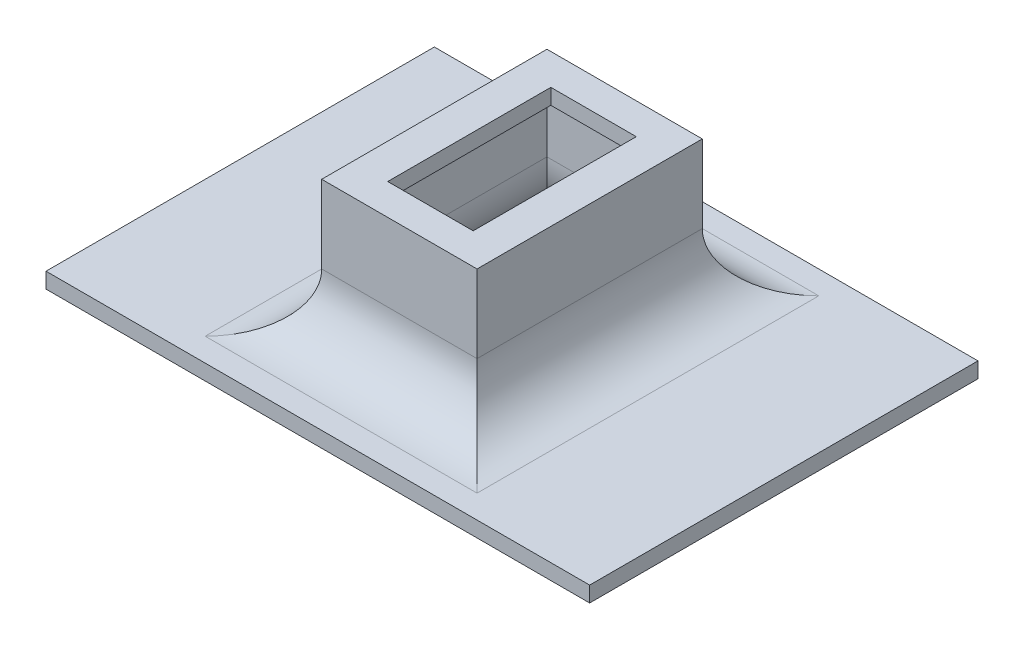
ISO-10303-21;
HEADER;
FILE_DESCRIPTION(('STEP AP214'),'2;1');
FILE_NAME('part.step','',(''),(''),'','','');
FILE_SCHEMA(('AUTOMOTIVE_DESIGN { 1 0 10303 214 1 1 1 1 }'));
ENDSEC;
DATA;
#1=APPLICATION_CONTEXT('core data for automotive mechanical design processes');
#2=APPLICATION_PROTOCOL_DEFINITION('international standard','automotive_design',2000,#1);
#3=PRODUCT_CONTEXT('',#1,'mechanical');
#4=PRODUCT('Part','Part','',(#3));
#5=PRODUCT_RELATED_PRODUCT_CATEGORY('part','',(#4));
#6=PRODUCT_DEFINITION_FORMATION('','',#4);
#7=PRODUCT_DEFINITION_CONTEXT('part definition',#1,'design');
#8=PRODUCT_DEFINITION('design','',#6,#7);
#9=PRODUCT_DEFINITION_SHAPE('','',#8);
#10=(LENGTH_UNIT() NAMED_UNIT(*) SI_UNIT(.MILLI.,.METRE.));
#11=(NAMED_UNIT(*) PLANE_ANGLE_UNIT() SI_UNIT($,.RADIAN.));
#12=(NAMED_UNIT(*) SI_UNIT($,.STERADIAN.) SOLID_ANGLE_UNIT());
#13=UNCERTAINTY_MEASURE_WITH_UNIT(LENGTH_MEASURE(1.E-05),#10,'distance_accuracy_value','');
#14=(GEOMETRIC_REPRESENTATION_CONTEXT(3) GLOBAL_UNCERTAINTY_ASSIGNED_CONTEXT((#13)) GLOBAL_UNIT_ASSIGNED_CONTEXT((#10,
#11,#12)) REPRESENTATION_CONTEXT('',''));
#15=CARTESIAN_POINT('',(0.,0.,0.));
#16=DIRECTION('',(0.,0.,1.));
#17=DIRECTION('',(1.,0.,0.));
#18=AXIS2_PLACEMENT_3D('',#15,#16,#17);
#19=CARTESIAN_POINT('',(0.,-4.,0.));
#20=DIRECTION('',(0.,1.,0.));
#21=DIRECTION('',(0.,0.,1.));
#22=AXIS2_PLACEMENT_3D('',#19,#20,#21);
#23=PLANE('',#22);
#24=DIRECTION('',(0.,0.,1.));
#25=VECTOR('',#24,1.);
#26=CARTESIAN_POINT('',(-70.,-4.,-50.));
#27=LINE('',#26,#25);
#28=CARTESIAN_POINT('',(-70.,-4.,-50.));
#29=VERTEX_POINT('',#28);
#30=CARTESIAN_POINT('',(-70.,-4.,50.));
#31=VERTEX_POINT('',#30);
#32=EDGE_CURVE('E273',#29,#31,#27,.T.);
#33=ORIENTED_EDGE('',*,*,#32,.F.);
#34=DIRECTION('',(-1.,0.,0.));
#35=VECTOR('',#34,1.);
#36=CARTESIAN_POINT('',(-70.,-4.,-50.));
#37=LINE('',#36,#35);
#38=CARTESIAN_POINT('',(70.,-4.,-50.));
#39=VERTEX_POINT('',#38);
#40=EDGE_CURVE('E283',#39,#29,#37,.T.);
#41=ORIENTED_EDGE('',*,*,#40,.F.);
#42=DIRECTION('',(0.,0.,-1.));
#43=VECTOR('',#42,1.);
#44=CARTESIAN_POINT('',(70.,-4.,-50.));
#45=LINE('',#44,#43);
#46=CARTESIAN_POINT('',(70.,-4.,50.));
#47=VERTEX_POINT('',#46);
#48=EDGE_CURVE('E280',#47,#39,#45,.T.);
#49=ORIENTED_EDGE('',*,*,#48,.F.);
#50=DIRECTION('',(1.,0.,0.));
#51=VECTOR('',#50,1.);
#52=CARTESIAN_POINT('',(-70.,-4.,50.));
#53=LINE('',#52,#51);
#54=EDGE_CURVE('E276',#31,#47,#53,.T.);
#55=ORIENTED_EDGE('',*,*,#54,.F.);
#56=EDGE_LOOP('',(#33,#41,#49,#55));
#57=FACE_BOUND('',#56,.T.);
#58=DIRECTION('',(1.,0.,0.));
#59=VECTOR('',#58,1.);
#60=CARTESIAN_POINT('',(0.,-4.,-44.));
#61=LINE('',#60,#59);
#62=CARTESIAN_POINT('',(-35.,-4.,-44.));
#63=VERTEX_POINT('',#62);
#64=CARTESIAN_POINT('',(35.,-4.,-44.));
#65=VERTEX_POINT('',#64);
#66=EDGE_CURVE('E208',#63,#65,#61,.T.);
#67=ORIENTED_EDGE('',*,*,#66,.F.);
#68=DIRECTION('',(0.,0.,1.));
#69=VECTOR('',#68,1.);
#70=CARTESIAN_POINT('',(-35.,-4.,0.));
#71=LINE('',#70,#69);
#72=CARTESIAN_POINT('',(-35.,-4.,44.));
#73=VERTEX_POINT('',#72);
#74=EDGE_CURVE('E205',#73,#63,#71,.F.);
#75=ORIENTED_EDGE('',*,*,#74,.F.);
#76=DIRECTION('',(1.,0.,0.));
#77=VECTOR('',#76,1.);
#78=CARTESIAN_POINT('',(0.,-4.,44.));
#79=LINE('',#78,#77);
#80=CARTESIAN_POINT('',(35.,-4.,44.));
#81=VERTEX_POINT('',#80);
#82=EDGE_CURVE('E200',#81,#73,#79,.F.);
#83=ORIENTED_EDGE('',*,*,#82,.F.);
#84=DIRECTION('',(0.,0.,1.));
#85=VECTOR('',#84,1.);
#86=CARTESIAN_POINT('',(35.,-4.,0.));
#87=LINE('',#86,#85);
#88=EDGE_CURVE('E203',#65,#81,#87,.T.);
#89=ORIENTED_EDGE('',*,*,#88,.F.);
#90=EDGE_LOOP('',(#67,#75,#83,#89));
#91=FACE_BOUND('',#90,.T.);
#92=ADVANCED_FACE('F34',(#57,#91),#23,.F.);
#93=CARTESIAN_POINT('',(0.,0.,0.));
#94=DIRECTION('',(0.,1.,0.));
#95=DIRECTION('',(0.,0.,1.));
#96=AXIS2_PLACEMENT_3D('',#93,#94,#95);
#97=PLANE('',#96);
#98=DIRECTION('',(1.,0.,0.));
#99=VECTOR('',#98,1.);
#100=CARTESIAN_POINT('',(0.,0.,44.));
#101=LINE('',#100,#99);
#102=CARTESIAN_POINT('',(35.,0.,44.));
#103=VERTEX_POINT('',#102);
#104=CARTESIAN_POINT('',(-35.,0.,44.));
#105=VERTEX_POINT('',#104);
#106=EDGE_CURVE('E307',#103,#105,#101,.F.);
#107=ORIENTED_EDGE('',*,*,#106,.T.);
#108=DIRECTION('',(0.,0.,1.));
#109=VECTOR('',#108,1.);
#110=CARTESIAN_POINT('',(-35.,0.,0.));
#111=LINE('',#110,#109);
#112=CARTESIAN_POINT('',(-35.,0.,-44.));
#113=VERTEX_POINT('',#112);
#114=EDGE_CURVE('E313',#105,#113,#111,.F.);
#115=ORIENTED_EDGE('',*,*,#114,.T.);
#116=DIRECTION('',(-1.,0.,0.));
#117=VECTOR('',#116,1.);
#118=CARTESIAN_POINT('',(0.,0.,-44.));
#119=LINE('',#118,#117);
#120=CARTESIAN_POINT('',(35.,0.,-44.));
#121=VERTEX_POINT('',#120);
#122=EDGE_CURVE('E311',#113,#121,#119,.F.);
#123=ORIENTED_EDGE('',*,*,#122,.T.);
#124=DIRECTION('',(0.,0.,-1.));
#125=VECTOR('',#124,1.);
#126=CARTESIAN_POINT('',(35.,0.,0.));
#127=LINE('',#126,#125);
#128=EDGE_CURVE('E309',#121,#103,#127,.F.);
#129=ORIENTED_EDGE('',*,*,#128,.T.);
#130=EDGE_LOOP('',(#107,#115,#123,#129));
#131=FACE_BOUND('',#130,.T.);
#132=DIRECTION('',(0.,0.,1.));
#133=VECTOR('',#132,1.);
#134=CARTESIAN_POINT('',(-70.,0.,-50.));
#135=LINE('',#134,#133);
#136=CARTESIAN_POINT('',(-70.,0.,-50.));
#137=VERTEX_POINT('',#136);
#138=CARTESIAN_POINT('',(-70.,0.,50.));
#139=VERTEX_POINT('',#138);
#140=EDGE_CURVE('E272',#137,#139,#135,.T.);
#141=ORIENTED_EDGE('',*,*,#140,.T.);
#142=DIRECTION('',(1.,0.,0.));
#143=VECTOR('',#142,1.);
#144=CARTESIAN_POINT('',(-70.,0.,50.));
#145=LINE('',#144,#143);
#146=CARTESIAN_POINT('',(70.,0.,50.));
#147=VERTEX_POINT('',#146);
#148=EDGE_CURVE('E289',#139,#147,#145,.T.);
#149=ORIENTED_EDGE('',*,*,#148,.T.);
#150=DIRECTION('',(0.,0.,-1.));
#151=VECTOR('',#150,1.);
#152=CARTESIAN_POINT('',(70.,0.,-50.));
#153=LINE('',#152,#151);
#154=CARTESIAN_POINT('',(70.,0.,-50.));
#155=VERTEX_POINT('',#154);
#156=EDGE_CURVE('E292',#147,#155,#153,.T.);
#157=ORIENTED_EDGE('',*,*,#156,.T.);
#158=DIRECTION('',(-1.,0.,0.));
#159=VECTOR('',#158,1.);
#160=CARTESIAN_POINT('',(-70.,0.,-50.));
#161=LINE('',#160,#159);
#162=EDGE_CURVE('E277',#155,#137,#161,.T.);
#163=ORIENTED_EDGE('',*,*,#162,.T.);
#164=EDGE_LOOP('',(#141,#149,#157,#163));
#165=FACE_BOUND('',#164,.T.);
#166=ADVANCED_FACE('F354',(#131,#165),#97,.T.);
#167=CARTESIAN_POINT('',(-70.,-4.,-50.));
#168=DIRECTION('',(-1.,0.,0.));
#169=DIRECTION('',(0.,0.,1.));
#170=AXIS2_PLACEMENT_3D('',#167,#168,#169);
#171=PLANE('',#170);
#172=ORIENTED_EDGE('',*,*,#140,.F.);
#173=DIRECTION('',(0.,1.,0.));
#174=VECTOR('',#173,1.);
#175=CARTESIAN_POINT('',(-70.,-4.,-50.));
#176=LINE('',#175,#174);
#177=EDGE_CURVE('E297',#29,#137,#176,.T.);
#178=ORIENTED_EDGE('',*,*,#177,.F.);
#179=ORIENTED_EDGE('',*,*,#32,.T.);
#180=DIRECTION('',(0.,1.,0.));
#181=VECTOR('',#180,1.);
#182=CARTESIAN_POINT('',(-70.,-4.,50.));
#183=LINE('',#182,#181);
#184=EDGE_CURVE('E286',#31,#139,#183,.T.);
#185=ORIENTED_EDGE('',*,*,#184,.T.);
#186=EDGE_LOOP('',(#172,#178,#179,#185));
#187=FACE_BOUND('',#186,.T.);
#188=ADVANCED_FACE('F360',(#187),#171,.T.);
#189=CARTESIAN_POINT('',(-70.,-4.,-50.));
#190=DIRECTION('',(0.,0.,-1.));
#191=DIRECTION('',(-1.,0.,0.));
#192=AXIS2_PLACEMENT_3D('',#189,#190,#191);
#193=PLANE('',#192);
#194=ORIENTED_EDGE('',*,*,#162,.F.);
#195=DIRECTION('',(0.,1.,0.));
#196=VECTOR('',#195,1.);
#197=CARTESIAN_POINT('',(70.,-4.,-50.));
#198=LINE('',#197,#196);
#199=EDGE_CURVE('E300',#39,#155,#198,.T.);
#200=ORIENTED_EDGE('',*,*,#199,.F.);
#201=ORIENTED_EDGE('',*,*,#40,.T.);
#202=ORIENTED_EDGE('',*,*,#177,.T.);
#203=EDGE_LOOP('',(#194,#200,#201,#202));
#204=FACE_BOUND('',#203,.T.);
#205=ADVANCED_FACE('F369',(#204),#193,.T.);
#206=CARTESIAN_POINT('',(70.,-4.,-50.));
#207=DIRECTION('',(1.,0.,0.));
#208=DIRECTION('',(0.,0.,-1.));
#209=AXIS2_PLACEMENT_3D('',#206,#207,#208);
#210=PLANE('',#209);
#211=ORIENTED_EDGE('',*,*,#156,.F.);
#212=DIRECTION('',(0.,1.,0.));
#213=VECTOR('',#212,1.);
#214=CARTESIAN_POINT('',(70.,-4.,50.));
#215=LINE('',#214,#213);
#216=EDGE_CURVE('E302',#47,#147,#215,.T.);
#217=ORIENTED_EDGE('',*,*,#216,.F.);
#218=ORIENTED_EDGE('',*,*,#48,.T.);
#219=ORIENTED_EDGE('',*,*,#199,.T.);
#220=EDGE_LOOP('',(#211,#217,#218,#219));
#221=FACE_BOUND('',#220,.T.);
#222=ADVANCED_FACE('F372',(#221),#210,.T.);
#223=CARTESIAN_POINT('',(-70.,-4.,50.));
#224=DIRECTION('',(0.,0.,1.));
#225=DIRECTION('',(1.,0.,0.));
#226=AXIS2_PLACEMENT_3D('',#223,#224,#225);
#227=PLANE('',#226);
#228=ORIENTED_EDGE('',*,*,#148,.F.);
#229=ORIENTED_EDGE('',*,*,#184,.F.);
#230=ORIENTED_EDGE('',*,*,#54,.T.);
#231=ORIENTED_EDGE('',*,*,#216,.T.);
#232=EDGE_LOOP('',(#228,#229,#230,#231));
#233=FACE_BOUND('',#232,.T.);
#234=ADVANCED_FACE('F376',(#233),#227,.T.);
#235=CARTESIAN_POINT('',(-20.,35.,-29.));
#236=DIRECTION('',(1.,0.,0.));
#237=DIRECTION('',(0.,0.,-1.));
#238=AXIS2_PLACEMENT_3D('',#235,#236,#237);
#239=PLANE('',#238);
#240=DIRECTION('',(0.,-1.,0.));
#241=VECTOR('',#240,1.);
#242=CARTESIAN_POINT('',(-20.,35.,-29.));
#243=LINE('',#242,#241);
#244=CARTESIAN_POINT('',(-20.,35.,-29.));
#245=VERTEX_POINT('',#244);
#246=CARTESIAN_POINT('',(-20.,15.,-29.));
#247=VERTEX_POINT('',#246);
#248=EDGE_CURVE('E260',#245,#247,#243,.T.);
#249=ORIENTED_EDGE('',*,*,#248,.T.);
#250=DIRECTION('',(0.,0.,1.));
#251=VECTOR('',#250,1.);
#252=CARTESIAN_POINT('',(-20.,15.,-29.));
#253=LINE('',#252,#251);
#254=CARTESIAN_POINT('',(-20.,15.,29.));
#255=VERTEX_POINT('',#254);
#256=EDGE_CURVE('E299',#247,#255,#253,.T.);
#257=ORIENTED_EDGE('',*,*,#256,.T.);
#258=DIRECTION('',(0.,-1.,0.));
#259=VECTOR('',#258,1.);
#260=CARTESIAN_POINT('',(-20.,35.,29.));
#261=LINE('',#260,#259);
#262=CARTESIAN_POINT('',(-20.,35.,29.));
#263=VERTEX_POINT('',#262);
#264=EDGE_CURVE('E269',#263,#255,#261,.T.);
#265=ORIENTED_EDGE('',*,*,#264,.F.);
#266=DIRECTION('',(0.,0.,1.));
#267=VECTOR('',#266,1.);
#268=CARTESIAN_POINT('',(-20.,35.,-29.));
#269=LINE('',#268,#267);
#270=EDGE_CURVE('E250',#245,#263,#269,.T.);
#271=ORIENTED_EDGE('',*,*,#270,.F.);
#272=EDGE_LOOP('',(#249,#257,#265,#271));
#273=FACE_BOUND('',#272,.T.);
#274=ADVANCED_FACE('F366',(#273),#239,.F.);
#275=CARTESIAN_POINT('',(-20.,35.,29.));
#276=DIRECTION('',(0.,0.,-1.));
#277=DIRECTION('',(-1.,0.,0.));
#278=AXIS2_PLACEMENT_3D('',#275,#276,#277);
#279=PLANE('',#278);
#280=ORIENTED_EDGE('',*,*,#264,.T.);
#281=DIRECTION('',(1.,0.,0.));
#282=VECTOR('',#281,1.);
#283=CARTESIAN_POINT('',(-20.,15.,29.));
#284=LINE('',#283,#282);
#285=CARTESIAN_POINT('',(20.,15.,29.));
#286=VERTEX_POINT('',#285);
#287=EDGE_CURVE('E320',#255,#286,#284,.T.);
#288=ORIENTED_EDGE('',*,*,#287,.T.);
#289=DIRECTION('',(0.,-1.,0.));
#290=VECTOR('',#289,1.);
#291=CARTESIAN_POINT('',(20.,35.,29.));
#292=LINE('',#291,#290);
#293=CARTESIAN_POINT('',(20.,35.,29.));
#294=VERTEX_POINT('',#293);
#295=EDGE_CURVE('E266',#294,#286,#292,.T.);
#296=ORIENTED_EDGE('',*,*,#295,.F.);
#297=DIRECTION('',(1.,0.,0.));
#298=VECTOR('',#297,1.);
#299=CARTESIAN_POINT('',(-20.,35.,29.));
#300=LINE('',#299,#298);
#301=EDGE_CURVE('E253',#263,#294,#300,.T.);
#302=ORIENTED_EDGE('',*,*,#301,.F.);
#303=EDGE_LOOP('',(#280,#288,#296,#302));
#304=FACE_BOUND('',#303,.T.);
#305=ADVANCED_FACE('F418',(#304),#279,.F.);
#306=CARTESIAN_POINT('',(20.,35.,-29.));
#307=DIRECTION('',(-1.,0.,0.));
#308=DIRECTION('',(0.,0.,1.));
#309=AXIS2_PLACEMENT_3D('',#306,#307,#308);
#310=PLANE('',#309);
#311=ORIENTED_EDGE('',*,*,#295,.T.);
#312=DIRECTION('',(0.,0.,-1.));
#313=VECTOR('',#312,1.);
#314=CARTESIAN_POINT('',(20.,15.,-29.));
#315=LINE('',#314,#313);
#316=CARTESIAN_POINT('',(20.,15.,-29.));
#317=VERTEX_POINT('',#316);
#318=EDGE_CURVE('E318',#286,#317,#315,.T.);
#319=ORIENTED_EDGE('',*,*,#318,.T.);
#320=DIRECTION('',(0.,-1.,0.));
#321=VECTOR('',#320,1.);
#322=CARTESIAN_POINT('',(20.,35.,-29.));
#323=LINE('',#322,#321);
#324=CARTESIAN_POINT('',(20.,35.,-29.));
#325=VERTEX_POINT('',#324);
#326=EDGE_CURVE('E263',#325,#317,#323,.T.);
#327=ORIENTED_EDGE('',*,*,#326,.F.);
#328=DIRECTION('',(0.,0.,-1.));
#329=VECTOR('',#328,1.);
#330=CARTESIAN_POINT('',(20.,35.,-29.));
#331=LINE('',#330,#329);
#332=EDGE_CURVE('E256',#294,#325,#331,.T.);
#333=ORIENTED_EDGE('',*,*,#332,.F.);
#334=EDGE_LOOP('',(#311,#319,#327,#333));
#335=FACE_BOUND('',#334,.T.);
#336=ADVANCED_FACE('F425',(#335),#310,.F.);
#337=CARTESIAN_POINT('',(-20.,35.,-29.));
#338=DIRECTION('',(0.,0.,1.));
#339=DIRECTION('',(1.,0.,0.));
#340=AXIS2_PLACEMENT_3D('',#337,#338,#339);
#341=PLANE('',#340);
#342=ORIENTED_EDGE('',*,*,#326,.T.);
#343=DIRECTION('',(-1.,0.,0.));
#344=VECTOR('',#343,1.);
#345=CARTESIAN_POINT('',(-20.,15.,-29.));
#346=LINE('',#345,#344);
#347=EDGE_CURVE('E316',#317,#247,#346,.T.);
#348=ORIENTED_EDGE('',*,*,#347,.T.);
#349=ORIENTED_EDGE('',*,*,#248,.F.);
#350=DIRECTION('',(-1.,0.,0.));
#351=VECTOR('',#350,1.);
#352=CARTESIAN_POINT('',(-20.,35.,-29.));
#353=LINE('',#352,#351);
#354=EDGE_CURVE('E258',#325,#245,#353,.T.);
#355=ORIENTED_EDGE('',*,*,#354,.F.);
#356=EDGE_LOOP('',(#342,#348,#349,#355));
#357=FACE_BOUND('',#356,.T.);
#358=ADVANCED_FACE('F423',(#357),#341,.F.);
#359=CARTESIAN_POINT('',(0.,35.,0.));
#360=DIRECTION('',(0.,1.,0.));
#361=DIRECTION('',(0.,0.,1.));
#362=AXIS2_PLACEMENT_3D('',#359,#360,#361);
#363=PLANE('',#362);
#364=DIRECTION('',(0.,0.,1.));
#365=VECTOR('',#364,1.);
#366=CARTESIAN_POINT('',(-11.,35.,-21.));
#367=LINE('',#366,#365);
#368=CARTESIAN_POINT('',(-11.,35.,-21.));
#369=VERTEX_POINT('',#368);
#370=CARTESIAN_POINT('',(-11.,35.,21.));
#371=VERTEX_POINT('',#370);
#372=EDGE_CURVE('E49',#369,#371,#367,.T.);
#373=ORIENTED_EDGE('',*,*,#372,.F.);
#374=DIRECTION('',(-1.,0.,0.));
#375=VECTOR('',#374,1.);
#376=CARTESIAN_POINT('',(-11.,35.,-21.));
#377=LINE('',#376,#375);
#378=CARTESIAN_POINT('',(11.,35.,-21.));
#379=VERTEX_POINT('',#378);
#380=EDGE_CURVE('E190',#379,#369,#377,.T.);
#381=ORIENTED_EDGE('',*,*,#380,.F.);
#382=DIRECTION('',(0.,0.,-1.));
#383=VECTOR('',#382,1.);
#384=CARTESIAN_POINT('',(11.,35.,-21.));
#385=LINE('',#384,#383);
#386=CARTESIAN_POINT('',(11.,35.,21.));
#387=VERTEX_POINT('',#386);
#388=EDGE_CURVE('E174',#387,#379,#385,.T.);
#389=ORIENTED_EDGE('',*,*,#388,.F.);
#390=DIRECTION('',(1.,0.,0.));
#391=VECTOR('',#390,1.);
#392=CARTESIAN_POINT('',(-11.,35.,21.));
#393=LINE('',#392,#391);
#394=EDGE_CURVE('E183',#371,#387,#393,.T.);
#395=ORIENTED_EDGE('',*,*,#394,.F.);
#396=EDGE_LOOP('',(#373,#381,#389,#395));
#397=FACE_BOUND('',#396,.T.);
#398=ORIENTED_EDGE('',*,*,#270,.T.);
#399=ORIENTED_EDGE('',*,*,#301,.T.);
#400=ORIENTED_EDGE('',*,*,#332,.T.);
#401=ORIENTED_EDGE('',*,*,#354,.T.);
#402=EDGE_LOOP('',(#398,#399,#400,#401));
#403=FACE_BOUND('',#402,.T.);
#404=ADVANCED_FACE('F187',(#397,#403),#363,.T.);
#405=CARTESIAN_POINT('',(35.,15.,-29.));
#406=DIRECTION('',(0.,0.,-1.));
#407=DIRECTION('',(-1.,0.,0.));
#408=AXIS2_PLACEMENT_3D('',#405,#406,#407);
#409=CYLINDRICAL_SURFACE('',#408,15.);
#410=CARTESIAN_POINT('',(35.,15.,44.));
#411=DIRECTION('',(0.707106781186547,0.,-0.707106781186548));
#412=DIRECTION('',(0.707106781186548,0.,0.707106781186547));
#413=AXIS2_PLACEMENT_3D('',#410,#411,#412);
#414=ELLIPSE('',#413,21.2132034355964,15.);
#415=EDGE_CURVE('E326',#103,#286,#414,.T.);
#416=ORIENTED_EDGE('',*,*,#415,.F.);
#417=ORIENTED_EDGE('',*,*,#128,.F.);
#418=CARTESIAN_POINT('',(35.,15.,-44.));
#419=DIRECTION('',(-0.707106781186548,0.,-0.707106781186547));
#420=DIRECTION('',(0.707106781186547,0.,-0.707106781186548));
#421=AXIS2_PLACEMENT_3D('',#418,#419,#420);
#422=ELLIPSE('',#421,21.2132034355964,15.);
#423=EDGE_CURVE('E254',#317,#121,#422,.F.);
#424=ORIENTED_EDGE('',*,*,#423,.F.);
#425=ORIENTED_EDGE('',*,*,#318,.F.);
#426=EDGE_LOOP('',(#416,#417,#424,#425));
#427=FACE_BOUND('',#426,.T.);
#428=ADVANCED_FACE('F36',(#427),#409,.F.);
#429=CARTESIAN_POINT('',(-20.,15.,-44.));
#430=DIRECTION('',(-1.,0.,0.));
#431=DIRECTION('',(0.,0.,1.));
#432=AXIS2_PLACEMENT_3D('',#429,#430,#431);
#433=CYLINDRICAL_SURFACE('',#432,15.);
#434=ORIENTED_EDGE('',*,*,#423,.T.);
#435=ORIENTED_EDGE('',*,*,#122,.F.);
#436=CARTESIAN_POINT('',(-35.,15.,-44.));
#437=DIRECTION('',(-0.707106781186547,0.,0.707106781186548));
#438=DIRECTION('',(-0.707106781186548,0.,-0.707106781186547));
#439=AXIS2_PLACEMENT_3D('',#436,#437,#438);
#440=ELLIPSE('',#439,21.2132034355964,15.);
#441=EDGE_CURVE('E324',#247,#113,#440,.F.);
#442=ORIENTED_EDGE('',*,*,#441,.F.);
#443=ORIENTED_EDGE('',*,*,#347,.F.);
#444=EDGE_LOOP('',(#434,#435,#442,#443));
#445=FACE_BOUND('',#444,.T.);
#446=ADVANCED_FACE('F391',(#445),#433,.F.);
#447=CARTESIAN_POINT('',(-20.,15.,44.));
#448=DIRECTION('',(1.,0.,0.));
#449=DIRECTION('',(0.,0.,-1.));
#450=AXIS2_PLACEMENT_3D('',#447,#448,#449);
#451=CYLINDRICAL_SURFACE('',#450,15.);
#452=ORIENTED_EDGE('',*,*,#415,.T.);
#453=ORIENTED_EDGE('',*,*,#287,.F.);
#454=CARTESIAN_POINT('',(-35.,15.,44.));
#455=DIRECTION('',(0.707106781186548,0.,0.707106781186547));
#456=DIRECTION('',(0.707106781186547,0.,-0.707106781186548));
#457=AXIS2_PLACEMENT_3D('',#454,#455,#456);
#458=ELLIPSE('',#457,21.2132034355964,15.);
#459=EDGE_CURVE('E227',#105,#255,#458,.T.);
#460=ORIENTED_EDGE('',*,*,#459,.F.);
#461=ORIENTED_EDGE('',*,*,#106,.F.);
#462=EDGE_LOOP('',(#452,#453,#460,#461));
#463=FACE_BOUND('',#462,.T.);
#464=ADVANCED_FACE('F388',(#463),#451,.F.);
#465=CARTESIAN_POINT('',(-35.,15.,-29.));
#466=DIRECTION('',(0.,0.,1.));
#467=DIRECTION('',(1.,0.,0.));
#468=AXIS2_PLACEMENT_3D('',#465,#466,#467);
#469=CYLINDRICAL_SURFACE('',#468,15.);
#470=ORIENTED_EDGE('',*,*,#441,.T.);
#471=ORIENTED_EDGE('',*,*,#114,.F.);
#472=ORIENTED_EDGE('',*,*,#459,.T.);
#473=ORIENTED_EDGE('',*,*,#256,.F.);
#474=EDGE_LOOP('',(#470,#471,#472,#473));
#475=FACE_BOUND('',#474,.T.);
#476=ADVANCED_FACE('F384',(#475),#469,.F.);
#477=CARTESIAN_POINT('',(-16.,35.,-29.));
#478=DIRECTION('',(1.,0.,0.));
#479=DIRECTION('',(0.,0.,-1.));
#480=AXIS2_PLACEMENT_3D('',#477,#478,#479);
#481=PLANE('',#480);
#482=DIRECTION('',(0.,-1.,0.));
#483=VECTOR('',#482,1.);
#484=CARTESIAN_POINT('',(-16.,35.,-25.));
#485=LINE('',#484,#483);
#486=CARTESIAN_POINT('',(-16.,31.,-25.));
#487=VERTEX_POINT('',#486);
#488=CARTESIAN_POINT('',(-16.,15.,-25.));
#489=VERTEX_POINT('',#488);
#490=EDGE_CURVE('E234',#487,#489,#485,.T.);
#491=ORIENTED_EDGE('',*,*,#490,.F.);
#492=DIRECTION('',(0.,0.,1.));
#493=VECTOR('',#492,1.);
#494=CARTESIAN_POINT('',(-16.,31.,-29.));
#495=LINE('',#494,#493);
#496=CARTESIAN_POINT('',(-16.,31.,25.));
#497=VERTEX_POINT('',#496);
#498=EDGE_CURVE('E218',#487,#497,#495,.T.);
#499=ORIENTED_EDGE('',*,*,#498,.T.);
#500=DIRECTION('',(0.,-1.,0.));
#501=VECTOR('',#500,1.);
#502=CARTESIAN_POINT('',(-16.,35.,25.));
#503=LINE('',#502,#501);
#504=CARTESIAN_POINT('',(-16.,15.,25.));
#505=VERTEX_POINT('',#504);
#506=EDGE_CURVE('E222',#497,#505,#503,.T.);
#507=ORIENTED_EDGE('',*,*,#506,.T.);
#508=DIRECTION('',(0.,0.,-1.));
#509=VECTOR('',#508,1.);
#510=CARTESIAN_POINT('',(-16.,15.,-29.));
#511=LINE('',#510,#509);
#512=EDGE_CURVE('E204',#489,#505,#511,.F.);
#513=ORIENTED_EDGE('',*,*,#512,.F.);
#514=EDGE_LOOP('',(#491,#499,#507,#513));
#515=FACE_BOUND('',#514,.T.);
#516=ADVANCED_FACE('F387',(#515),#481,.T.);
#517=CARTESIAN_POINT('',(-20.,35.,25.));
#518=DIRECTION('',(0.,0.,-1.));
#519=DIRECTION('',(-1.,0.,0.));
#520=AXIS2_PLACEMENT_3D('',#517,#518,#519);
#521=PLANE('',#520);
#522=ORIENTED_EDGE('',*,*,#506,.F.);
#523=DIRECTION('',(1.,0.,0.));
#524=VECTOR('',#523,1.);
#525=CARTESIAN_POINT('',(-20.,31.,25.));
#526=LINE('',#525,#524);
#527=CARTESIAN_POINT('',(16.,31.,25.));
#528=VERTEX_POINT('',#527);
#529=EDGE_CURVE('E231',#497,#528,#526,.T.);
#530=ORIENTED_EDGE('',*,*,#529,.T.);
#531=DIRECTION('',(0.,-1.,0.));
#532=VECTOR('',#531,1.);
#533=CARTESIAN_POINT('',(16.,35.,25.));
#534=LINE('',#533,#532);
#535=CARTESIAN_POINT('',(16.,15.,25.));
#536=VERTEX_POINT('',#535);
#537=EDGE_CURVE('E225',#528,#536,#534,.T.);
#538=ORIENTED_EDGE('',*,*,#537,.T.);
#539=DIRECTION('',(-1.,0.,0.));
#540=VECTOR('',#539,1.);
#541=CARTESIAN_POINT('',(-20.,15.,25.));
#542=LINE('',#541,#540);
#543=EDGE_CURVE('E221',#505,#536,#542,.F.);
#544=ORIENTED_EDGE('',*,*,#543,.F.);
#545=EDGE_LOOP('',(#522,#530,#538,#544));
#546=FACE_BOUND('',#545,.T.);
#547=ADVANCED_FACE('F456',(#546),#521,.T.);
#548=CARTESIAN_POINT('',(16.,35.,-29.));
#549=DIRECTION('',(-1.,0.,0.));
#550=DIRECTION('',(0.,0.,1.));
#551=AXIS2_PLACEMENT_3D('',#548,#549,#550);
#552=PLANE('',#551);
#553=ORIENTED_EDGE('',*,*,#537,.F.);
#554=DIRECTION('',(0.,0.,-1.));
#555=VECTOR('',#554,1.);
#556=CARTESIAN_POINT('',(16.,31.,-29.));
#557=LINE('',#556,#555);
#558=CARTESIAN_POINT('',(16.,31.,-25.));
#559=VERTEX_POINT('',#558);
#560=EDGE_CURVE('E233',#528,#559,#557,.T.);
#561=ORIENTED_EDGE('',*,*,#560,.T.);
#562=DIRECTION('',(0.,-1.,0.));
#563=VECTOR('',#562,1.);
#564=CARTESIAN_POINT('',(16.,35.,-25.));
#565=LINE('',#564,#563);
#566=CARTESIAN_POINT('',(16.,15.,-25.));
#567=VERTEX_POINT('',#566);
#568=EDGE_CURVE('E230',#559,#567,#565,.T.);
#569=ORIENTED_EDGE('',*,*,#568,.T.);
#570=DIRECTION('',(0.,0.,1.));
#571=VECTOR('',#570,1.);
#572=CARTESIAN_POINT('',(16.,15.,-29.));
#573=LINE('',#572,#571);
#574=EDGE_CURVE('E219',#536,#567,#573,.F.);
#575=ORIENTED_EDGE('',*,*,#574,.F.);
#576=EDGE_LOOP('',(#553,#561,#569,#575));
#577=FACE_BOUND('',#576,.T.);
#578=ADVANCED_FACE('F452',(#577),#552,.T.);
#579=CARTESIAN_POINT('',(-20.,35.,-25.));
#580=DIRECTION('',(0.,0.,1.));
#581=DIRECTION('',(1.,0.,0.));
#582=AXIS2_PLACEMENT_3D('',#579,#580,#581);
#583=PLANE('',#582);
#584=ORIENTED_EDGE('',*,*,#568,.F.);
#585=DIRECTION('',(-1.,0.,0.));
#586=VECTOR('',#585,1.);
#587=CARTESIAN_POINT('',(-20.,31.,-25.));
#588=LINE('',#587,#586);
#589=EDGE_CURVE('E237',#559,#487,#588,.T.);
#590=ORIENTED_EDGE('',*,*,#589,.T.);
#591=ORIENTED_EDGE('',*,*,#490,.T.);
#592=DIRECTION('',(1.,0.,0.));
#593=VECTOR('',#592,1.);
#594=CARTESIAN_POINT('',(-20.,15.,-25.));
#595=LINE('',#594,#593);
#596=EDGE_CURVE('E207',#567,#489,#595,.F.);
#597=ORIENTED_EDGE('',*,*,#596,.F.);
#598=EDGE_LOOP('',(#584,#590,#591,#597));
#599=FACE_BOUND('',#598,.T.);
#600=ADVANCED_FACE('F449',(#599),#583,.T.);
#601=CARTESIAN_POINT('',(0.,31.,0.));
#602=DIRECTION('',(0.,1.,0.));
#603=DIRECTION('',(0.,0.,1.));
#604=AXIS2_PLACEMENT_3D('',#601,#602,#603);
#605=PLANE('',#604);
#606=DIRECTION('',(-1.,0.,0.));
#607=VECTOR('',#606,1.);
#608=CARTESIAN_POINT('',(0.,31.,-21.));
#609=LINE('',#608,#607);
#610=CARTESIAN_POINT('',(11.,31.,-21.));
#611=VERTEX_POINT('',#610);
#612=CARTESIAN_POINT('',(-11.,31.,-21.));
#613=VERTEX_POINT('',#612);
#614=EDGE_CURVE('E42',#611,#613,#609,.T.);
#615=ORIENTED_EDGE('',*,*,#614,.T.);
#616=DIRECTION('',(0.,0.,1.));
#617=VECTOR('',#616,1.);
#618=CARTESIAN_POINT('',(-11.,31.,0.));
#619=LINE('',#618,#617);
#620=CARTESIAN_POINT('',(-11.,31.,21.));
#621=VERTEX_POINT('',#620);
#622=EDGE_CURVE('E11',#613,#621,#619,.T.);
#623=ORIENTED_EDGE('',*,*,#622,.T.);
#624=DIRECTION('',(1.,0.,0.));
#625=VECTOR('',#624,1.);
#626=CARTESIAN_POINT('',(0.,31.,21.));
#627=LINE('',#626,#625);
#628=CARTESIAN_POINT('',(11.,31.,21.));
#629=VERTEX_POINT('',#628);
#630=EDGE_CURVE('E322',#621,#629,#627,.T.);
#631=ORIENTED_EDGE('',*,*,#630,.T.);
#632=DIRECTION('',(0.,0.,-1.));
#633=VECTOR('',#632,1.);
#634=CARTESIAN_POINT('',(11.,31.,0.));
#635=LINE('',#634,#633);
#636=EDGE_CURVE('E177',#629,#611,#635,.T.);
#637=ORIENTED_EDGE('',*,*,#636,.T.);
#638=EDGE_LOOP('',(#615,#623,#631,#637));
#639=FACE_BOUND('',#638,.T.);
#640=ORIENTED_EDGE('',*,*,#498,.F.);
#641=ORIENTED_EDGE('',*,*,#589,.F.);
#642=ORIENTED_EDGE('',*,*,#560,.F.);
#643=ORIENTED_EDGE('',*,*,#529,.F.);
#644=EDGE_LOOP('',(#640,#641,#642,#643));
#645=FACE_BOUND('',#644,.T.);
#646=ADVANCED_FACE('F334',(#639,#645),#605,.F.);
#647=CARTESIAN_POINT('',(35.,15.,-29.));
#648=DIRECTION('',(0.,0.,-1.));
#649=DIRECTION('',(-1.,0.,0.));
#650=AXIS2_PLACEMENT_3D('',#647,#648,#649);
#651=CYLINDRICAL_SURFACE('',#650,19.);
#652=CARTESIAN_POINT('',(35.,15.,44.));
#653=DIRECTION('',(0.707106781186547,0.,-0.707106781186548));
#654=DIRECTION('',(0.707106781186548,0.,0.707106781186547));
#655=AXIS2_PLACEMENT_3D('',#652,#653,#654);
#656=ELLIPSE('',#655,26.8700576850888,19.);
#657=EDGE_CURVE('E211',#81,#536,#656,.T.);
#658=ORIENTED_EDGE('',*,*,#657,.T.);
#659=ORIENTED_EDGE('',*,*,#574,.T.);
#660=CARTESIAN_POINT('',(35.,15.,-44.));
#661=DIRECTION('',(-0.707106781186548,0.,-0.707106781186547));
#662=DIRECTION('',(-0.707106781186547,0.,0.707106781186548));
#663=AXIS2_PLACEMENT_3D('',#660,#661,#662);
#664=ELLIPSE('',#663,26.8700576850888,19.);
#665=EDGE_CURVE('E214',#567,#65,#664,.F.);
#666=ORIENTED_EDGE('',*,*,#665,.T.);
#667=ORIENTED_EDGE('',*,*,#88,.T.);
#668=EDGE_LOOP('',(#658,#659,#666,#667));
#669=FACE_BOUND('',#668,.T.);
#670=ADVANCED_FACE('F442',(#669),#651,.T.);
#671=CARTESIAN_POINT('',(-20.,15.,-44.));
#672=DIRECTION('',(-1.,0.,0.));
#673=DIRECTION('',(0.,0.,1.));
#674=AXIS2_PLACEMENT_3D('',#671,#672,#673);
#675=CYLINDRICAL_SURFACE('',#674,19.);
#676=ORIENTED_EDGE('',*,*,#665,.F.);
#677=ORIENTED_EDGE('',*,*,#596,.T.);
#678=CARTESIAN_POINT('',(-35.,15.,-44.));
#679=DIRECTION('',(-0.707106781186547,0.,0.707106781186548));
#680=DIRECTION('',(0.707106781186548,0.,0.707106781186547));
#681=AXIS2_PLACEMENT_3D('',#678,#679,#680);
#682=ELLIPSE('',#681,26.8700576850888,19.);
#683=EDGE_CURVE('E215',#489,#63,#682,.F.);
#684=ORIENTED_EDGE('',*,*,#683,.T.);
#685=ORIENTED_EDGE('',*,*,#66,.T.);
#686=EDGE_LOOP('',(#676,#677,#684,#685));
#687=FACE_BOUND('',#686,.T.);
#688=ADVANCED_FACE('F438',(#687),#675,.T.);
#689=CARTESIAN_POINT('',(-20.,15.,44.));
#690=DIRECTION('',(1.,0.,0.));
#691=DIRECTION('',(0.,0.,-1.));
#692=AXIS2_PLACEMENT_3D('',#689,#690,#691);
#693=CYLINDRICAL_SURFACE('',#692,19.);
#694=ORIENTED_EDGE('',*,*,#657,.F.);
#695=ORIENTED_EDGE('',*,*,#82,.T.);
#696=CARTESIAN_POINT('',(-35.,15.,44.));
#697=DIRECTION('',(0.707106781186548,0.,0.707106781186547));
#698=DIRECTION('',(-0.707106781186547,0.,0.707106781186548));
#699=AXIS2_PLACEMENT_3D('',#696,#697,#698);
#700=ELLIPSE('',#699,26.8700576850888,19.);
#701=EDGE_CURVE('E197',#73,#505,#700,.T.);
#702=ORIENTED_EDGE('',*,*,#701,.T.);
#703=ORIENTED_EDGE('',*,*,#543,.T.);
#704=EDGE_LOOP('',(#694,#695,#702,#703));
#705=FACE_BOUND('',#704,.T.);
#706=ADVANCED_FACE('F348',(#705),#693,.T.);
#707=CARTESIAN_POINT('',(-35.,15.,-29.));
#708=DIRECTION('',(0.,0.,1.));
#709=DIRECTION('',(1.,0.,0.));
#710=AXIS2_PLACEMENT_3D('',#707,#708,#709);
#711=CYLINDRICAL_SURFACE('',#710,19.);
#712=ORIENTED_EDGE('',*,*,#683,.F.);
#713=ORIENTED_EDGE('',*,*,#512,.T.);
#714=ORIENTED_EDGE('',*,*,#701,.F.);
#715=ORIENTED_EDGE('',*,*,#74,.T.);
#716=EDGE_LOOP('',(#712,#713,#714,#715));
#717=FACE_BOUND('',#716,.T.);
#718=ADVANCED_FACE('F341',(#717),#711,.T.);
#719=CARTESIAN_POINT('',(-11.,-4.,-21.));
#720=DIRECTION('',(-1.,0.,0.));
#721=DIRECTION('',(0.,0.,1.));
#722=AXIS2_PLACEMENT_3D('',#719,#720,#721);
#723=PLANE('',#722);
#724=DIRECTION('',(0.,1.,0.));
#725=VECTOR('',#724,1.);
#726=CARTESIAN_POINT('',(-11.,-4.,-21.));
#727=LINE('',#726,#725);
#728=EDGE_CURVE('E195',#613,#369,#727,.T.);
#729=ORIENTED_EDGE('',*,*,#728,.T.);
#730=ORIENTED_EDGE('',*,*,#372,.T.);
#731=DIRECTION('',(0.,1.,0.));
#732=VECTOR('',#731,1.);
#733=CARTESIAN_POINT('',(-11.,-4.,21.));
#734=LINE('',#733,#732);
#735=EDGE_CURVE('E180',#621,#371,#734,.T.);
#736=ORIENTED_EDGE('',*,*,#735,.F.);
#737=ORIENTED_EDGE('',*,*,#622,.F.);
#738=EDGE_LOOP('',(#729,#730,#736,#737));
#739=FACE_BOUND('',#738,.T.);
#740=ADVANCED_FACE('F339',(#739),#723,.F.);
#741=CARTESIAN_POINT('',(-11.,-4.,-21.));
#742=DIRECTION('',(0.,0.,-1.));
#743=DIRECTION('',(-1.,0.,0.));
#744=AXIS2_PLACEMENT_3D('',#741,#742,#743);
#745=PLANE('',#744);
#746=DIRECTION('',(0.,1.,0.));
#747=VECTOR('',#746,1.);
#748=CARTESIAN_POINT('',(11.,-4.,-21.));
#749=LINE('',#748,#747);
#750=EDGE_CURVE('E179',#611,#379,#749,.T.);
#751=ORIENTED_EDGE('',*,*,#750,.T.);
#752=ORIENTED_EDGE('',*,*,#380,.T.);
#753=ORIENTED_EDGE('',*,*,#728,.F.);
#754=ORIENTED_EDGE('',*,*,#614,.F.);
#755=EDGE_LOOP('',(#751,#752,#753,#754));
#756=FACE_BOUND('',#755,.T.);
#757=ADVANCED_FACE('F338',(#756),#745,.F.);
#758=CARTESIAN_POINT('',(11.,-4.,-21.));
#759=DIRECTION('',(1.,0.,0.));
#760=DIRECTION('',(0.,0.,-1.));
#761=AXIS2_PLACEMENT_3D('',#758,#759,#760);
#762=PLANE('',#761);
#763=DIRECTION('',(0.,1.,0.));
#764=VECTOR('',#763,1.);
#765=CARTESIAN_POINT('',(11.,-4.,21.));
#766=LINE('',#765,#764);
#767=EDGE_CURVE('E57',#629,#387,#766,.T.);
#768=ORIENTED_EDGE('',*,*,#767,.T.);
#769=ORIENTED_EDGE('',*,*,#388,.T.);
#770=ORIENTED_EDGE('',*,*,#750,.F.);
#771=ORIENTED_EDGE('',*,*,#636,.F.);
#772=EDGE_LOOP('',(#768,#769,#770,#771));
#773=FACE_BOUND('',#772,.T.);
#774=ADVANCED_FACE('F171',(#773),#762,.F.);
#775=CARTESIAN_POINT('',(-11.,-4.,21.));
#776=DIRECTION('',(0.,0.,1.));
#777=DIRECTION('',(1.,0.,0.));
#778=AXIS2_PLACEMENT_3D('',#775,#776,#777);
#779=PLANE('',#778);
#780=ORIENTED_EDGE('',*,*,#735,.T.);
#781=ORIENTED_EDGE('',*,*,#394,.T.);
#782=ORIENTED_EDGE('',*,*,#767,.F.);
#783=ORIENTED_EDGE('',*,*,#630,.F.);
#784=EDGE_LOOP('',(#780,#781,#782,#783));
#785=FACE_BOUND('',#784,.T.);
#786=ADVANCED_FACE('F184',(#785),#779,.F.);
#787=CLOSED_SHELL('',(#92,#166,#188,#205,#222,#234,#274,#305,#336,#358,#404,#428,#446,#464,#476,
#516,#547,#578,#600,#646,#670,#688,#706,#718,#740,#757,#774,#786));
#788=MANIFOLD_SOLID_BREP('B2',#787);
#789=ADVANCED_BREP_SHAPE_REPRESENTATION('',(#18,#788),#14);
#790=SHAPE_DEFINITION_REPRESENTATION(#9,#789);
ENDSEC;
END-ISO-10303-21;
